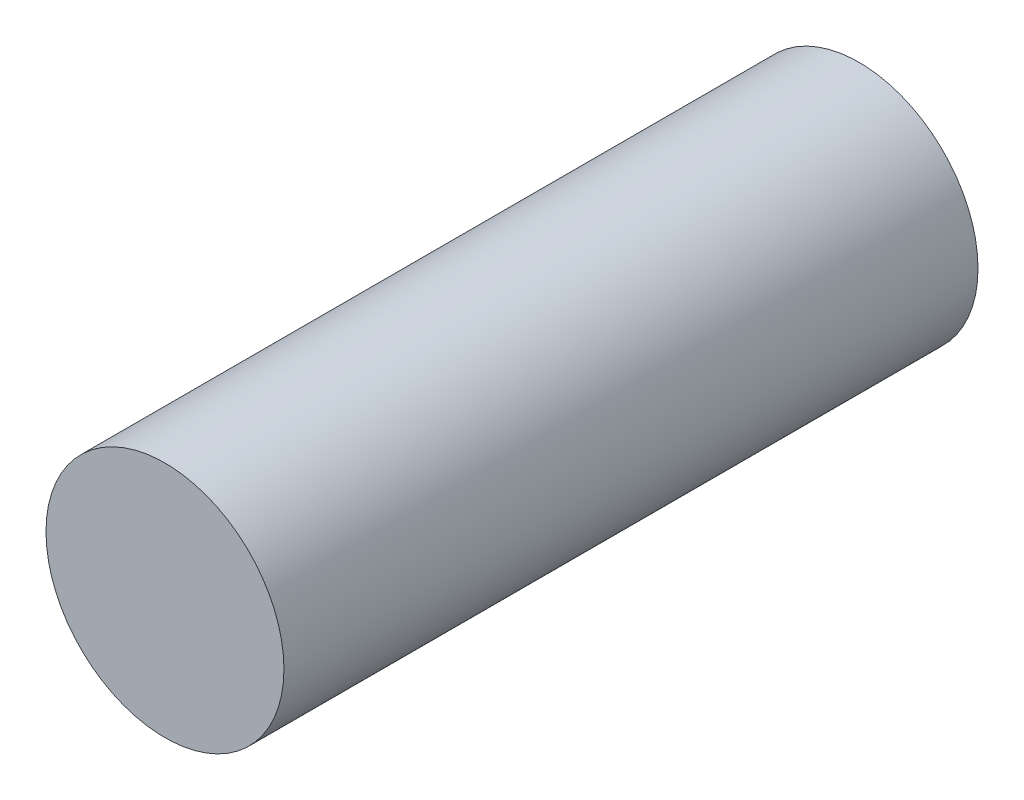
ISO-10303-21;
HEADER;
FILE_DESCRIPTION(('STEP AP214'),'2;1');
FILE_NAME('part.step','',(''),(''),'','','');
FILE_SCHEMA(('AUTOMOTIVE_DESIGN { 1 0 10303 214 1 1 1 1 }'));
ENDSEC;
DATA;
#1=APPLICATION_CONTEXT('core data for automotive mechanical design processes');
#2=APPLICATION_PROTOCOL_DEFINITION('international standard','automotive_design',2000,#1);
#3=PRODUCT_CONTEXT('',#1,'mechanical');
#4=PRODUCT('Part','Part','',(#3));
#5=PRODUCT_RELATED_PRODUCT_CATEGORY('part','',(#4));
#6=PRODUCT_DEFINITION_FORMATION('','',#4);
#7=PRODUCT_DEFINITION_CONTEXT('part definition',#1,'design');
#8=PRODUCT_DEFINITION('design','',#6,#7);
#9=PRODUCT_DEFINITION_SHAPE('','',#8);
#10=(LENGTH_UNIT() NAMED_UNIT(*) SI_UNIT(.MILLI.,.METRE.));
#11=(NAMED_UNIT(*) PLANE_ANGLE_UNIT() SI_UNIT($,.RADIAN.));
#12=(NAMED_UNIT(*) SI_UNIT($,.STERADIAN.) SOLID_ANGLE_UNIT());
#13=UNCERTAINTY_MEASURE_WITH_UNIT(LENGTH_MEASURE(1.E-05),#10,'distance_accuracy_value','');
#14=(GEOMETRIC_REPRESENTATION_CONTEXT(3) GLOBAL_UNCERTAINTY_ASSIGNED_CONTEXT((#13)) GLOBAL_UNIT_ASSIGNED_CONTEXT((#10,
#11,#12)) REPRESENTATION_CONTEXT('',''));
#15=CARTESIAN_POINT('',(0.,0.,0.));
#16=DIRECTION('',(0.,0.,1.));
#17=DIRECTION('',(1.,0.,0.));
#18=AXIS2_PLACEMENT_3D('',#15,#16,#17);
#19=CARTESIAN_POINT('',(0.,0.,35.));
#20=DIRECTION('',(0.,0.,-1.));
#21=DIRECTION('',(-1.,0.,0.));
#22=AXIS2_PLACEMENT_3D('',#19,#20,#21);
#23=CYLINDRICAL_SURFACE('',#22,6.);
#24=CARTESIAN_POINT('',(0.,0.,35.));
#25=DIRECTION('',(0.,0.,1.));
#26=DIRECTION('',(1.,0.,0.));
#27=AXIS2_PLACEMENT_3D('',#24,#25,#26);
#28=CIRCLE('',#27,6.);
#29=CARTESIAN_POINT('',(6.,0.,35.));
#30=VERTEX_POINT('',#29);
#31=EDGE_CURVE('E10',#30,#30,#28,.T.);
#32=ORIENTED_EDGE('',*,*,#31,.F.);
#33=EDGE_LOOP('',(#32));
#34=FACE_BOUND('',#33,.T.);
#35=CARTESIAN_POINT('',(0.,0.,0.));
#36=DIRECTION('',(0.,0.,1.));
#37=DIRECTION('',(1.,0.,0.));
#38=AXIS2_PLACEMENT_3D('',#35,#36,#37);
#39=CIRCLE('',#38,6.);
#40=CARTESIAN_POINT('',(6.,0.,0.));
#41=VERTEX_POINT('',#40);
#42=EDGE_CURVE('E34',#41,#41,#39,.T.);
#43=ORIENTED_EDGE('',*,*,#42,.T.);
#44=EDGE_LOOP('',(#43));
#45=FACE_BOUND('',#44,.T.);
#46=ADVANCED_FACE('F31',(#34,#45),#23,.T.);
#47=CARTESIAN_POINT('',(0.,0.,35.));
#48=DIRECTION('',(0.,0.,1.));
#49=DIRECTION('',(1.,0.,0.));
#50=AXIS2_PLACEMENT_3D('',#47,#48,#49);
#51=PLANE('',#50);
#52=ORIENTED_EDGE('',*,*,#31,.T.);
#53=EDGE_LOOP('',(#52));
#54=FACE_BOUND('',#53,.T.);
#55=ADVANCED_FACE('F46',(#54),#51,.T.);
#56=CARTESIAN_POINT('',(0.,0.,0.));
#57=DIRECTION('',(0.,0.,1.));
#58=DIRECTION('',(1.,0.,0.));
#59=AXIS2_PLACEMENT_3D('',#56,#57,#58);
#60=PLANE('',#59);
#61=ORIENTED_EDGE('',*,*,#42,.F.);
#62=EDGE_LOOP('',(#61));
#63=FACE_BOUND('',#62,.T.);
#64=ADVANCED_FACE('F44',(#63),#60,.F.);
#65=CLOSED_SHELL('',(#46,#55,#64));
#66=MANIFOLD_SOLID_BREP('B2',#65);
#67=ADVANCED_BREP_SHAPE_REPRESENTATION('',(#18,#66),#14);
#68=SHAPE_DEFINITION_REPRESENTATION(#9,#67);
ENDSEC;
END-ISO-10303-21;
